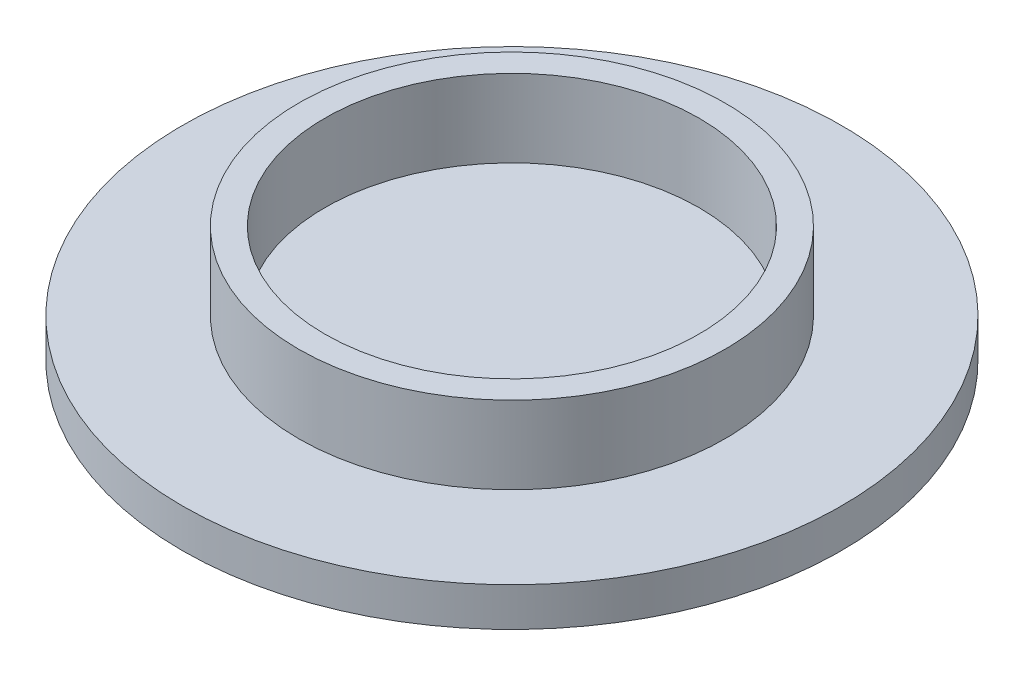
ISO-10303-21;
HEADER;
FILE_DESCRIPTION(('STEP AP214'),'2;1');
FILE_NAME('part.step','',(''),(''),'','','');
FILE_SCHEMA(('AUTOMOTIVE_DESIGN { 1 0 10303 214 1 1 1 1 }'));
ENDSEC;
DATA;
#1=APPLICATION_CONTEXT('core data for automotive mechanical design processes');
#2=APPLICATION_PROTOCOL_DEFINITION('international standard','automotive_design',2000,#1);
#3=PRODUCT_CONTEXT('',#1,'mechanical');
#4=PRODUCT('Part','Part','',(#3));
#5=PRODUCT_RELATED_PRODUCT_CATEGORY('part','',(#4));
#6=PRODUCT_DEFINITION_FORMATION('','',#4);
#7=PRODUCT_DEFINITION_CONTEXT('part definition',#1,'design');
#8=PRODUCT_DEFINITION('design','',#6,#7);
#9=PRODUCT_DEFINITION_SHAPE('','',#8);
#10=(LENGTH_UNIT() NAMED_UNIT(*) SI_UNIT(.MILLI.,.METRE.));
#11=(NAMED_UNIT(*) PLANE_ANGLE_UNIT() SI_UNIT($,.RADIAN.));
#12=(NAMED_UNIT(*) SI_UNIT($,.STERADIAN.) SOLID_ANGLE_UNIT());
#13=UNCERTAINTY_MEASURE_WITH_UNIT(LENGTH_MEASURE(1.E-05),#10,'distance_accuracy_value','');
#14=(GEOMETRIC_REPRESENTATION_CONTEXT(3) GLOBAL_UNCERTAINTY_ASSIGNED_CONTEXT((#13)) GLOBAL_UNIT_ASSIGNED_CONTEXT((#10,
#11,#12)) REPRESENTATION_CONTEXT('',''));
#15=CARTESIAN_POINT('',(0.,0.,0.));
#16=DIRECTION('',(0.,0.,1.));
#17=DIRECTION('',(1.,0.,0.));
#18=AXIS2_PLACEMENT_3D('',#15,#16,#17);
#19=CARTESIAN_POINT('',(0.,-1.,0.));
#20=DIRECTION('',(0.,1.,0.));
#21=DIRECTION('',(0.,0.,1.));
#22=AXIS2_PLACEMENT_3D('',#19,#20,#21);
#23=CYLINDRICAL_SURFACE('',#22,17.);
#24=CARTESIAN_POINT('',(0.,0.,0.));
#25=DIRECTION('',(0.,1.,0.));
#26=DIRECTION('',(0.,0.,1.));
#27=AXIS2_PLACEMENT_3D('',#24,#25,#26);
#28=CIRCLE('',#27,17.);
#29=CARTESIAN_POINT('',(0.,0.,17.));
#30=VERTEX_POINT('',#29);
#31=EDGE_CURVE('E42',#30,#30,#28,.T.);
#32=ORIENTED_EDGE('',*,*,#31,.F.);
#33=EDGE_LOOP('',(#32));
#34=FACE_BOUND('',#33,.T.);
#35=CARTESIAN_POINT('',(0.,-2.,0.));
#36=DIRECTION('',(0.,1.,0.));
#37=DIRECTION('',(0.,0.,1.));
#38=AXIS2_PLACEMENT_3D('',#35,#36,#37);
#39=CIRCLE('',#38,17.);
#40=CARTESIAN_POINT('',(0.,-2.,17.));
#41=VERTEX_POINT('',#40);
#42=EDGE_CURVE('E57',#41,#41,#39,.T.);
#43=ORIENTED_EDGE('',*,*,#42,.T.);
#44=EDGE_LOOP('',(#43));
#45=FACE_BOUND('',#44,.T.);
#46=ADVANCED_FACE('F32',(#34,#45),#23,.T.);
#47=CARTESIAN_POINT('',(0.,0.,0.));
#48=DIRECTION('',(0.,1.,0.));
#49=DIRECTION('',(0.,0.,1.));
#50=AXIS2_PLACEMENT_3D('',#47,#48,#49);
#51=PLANE('',#50);
#52=CARTESIAN_POINT('',(0.,0.,0.));
#53=DIRECTION('',(0.,1.,0.));
#54=DIRECTION('',(0.,0.,1.));
#55=AXIS2_PLACEMENT_3D('',#52,#53,#54);
#56=CIRCLE('',#55,11.);
#57=CARTESIAN_POINT('',(0.,0.,11.));
#58=VERTEX_POINT('',#57);
#59=EDGE_CURVE('E49',#58,#58,#56,.T.);
#60=ORIENTED_EDGE('',*,*,#59,.F.);
#61=EDGE_LOOP('',(#60));
#62=FACE_BOUND('',#61,.T.);
#63=ORIENTED_EDGE('',*,*,#31,.T.);
#64=EDGE_LOOP('',(#63));
#65=FACE_BOUND('',#64,.T.);
#66=ADVANCED_FACE('F92',(#62,#65),#51,.T.);
#67=CARTESIAN_POINT('',(0.,4.,0.));
#68=DIRECTION('',(0.,1.,0.));
#69=DIRECTION('',(0.,0.,1.));
#70=AXIS2_PLACEMENT_3D('',#67,#68,#69);
#71=PLANE('',#70);
#72=CARTESIAN_POINT('',(0.,4.,0.));
#73=DIRECTION('',(0.,1.,0.));
#74=DIRECTION('',(0.,0.,1.));
#75=AXIS2_PLACEMENT_3D('',#72,#73,#74);
#76=CIRCLE('',#75,11.);
#77=CARTESIAN_POINT('',(0.,4.,11.));
#78=VERTEX_POINT('',#77);
#79=EDGE_CURVE('E46',#78,#78,#76,.T.);
#80=ORIENTED_EDGE('',*,*,#79,.T.);
#81=EDGE_LOOP('',(#80));
#82=FACE_BOUND('',#81,.T.);
#83=CARTESIAN_POINT('',(0.,4.,0.));
#84=DIRECTION('',(0.,1.,0.));
#85=DIRECTION('',(0.,0.,1.));
#86=AXIS2_PLACEMENT_3D('',#83,#84,#85);
#87=CIRCLE('',#86,9.652);
#88=CARTESIAN_POINT('',(0.,4.,9.652));
#89=VERTEX_POINT('',#88);
#90=EDGE_CURVE('E52',#89,#89,#87,.T.);
#91=ORIENTED_EDGE('',*,*,#90,.F.);
#92=EDGE_LOOP('',(#91));
#93=FACE_BOUND('',#92,.T.);
#94=ADVANCED_FACE('F97',(#82,#93),#71,.T.);
#95=CARTESIAN_POINT('',(0.,4.,0.));
#96=DIRECTION('',(0.,-1.,0.));
#97=DIRECTION('',(0.,0.,-1.));
#98=AXIS2_PLACEMENT_3D('',#95,#96,#97);
#99=CYLINDRICAL_SURFACE('',#98,11.);
#100=ORIENTED_EDGE('',*,*,#79,.F.);
#101=EDGE_LOOP('',(#100));
#102=FACE_BOUND('',#101,.T.);
#103=ORIENTED_EDGE('',*,*,#59,.T.);
#104=EDGE_LOOP('',(#103));
#105=FACE_BOUND('',#104,.T.);
#106=ADVANCED_FACE('F107',(#102,#105),#99,.T.);
#107=CARTESIAN_POINT('',(0.,4.,0.));
#108=DIRECTION('',(0.,-1.,0.));
#109=DIRECTION('',(0.,0.,-1.));
#110=AXIS2_PLACEMENT_3D('',#107,#108,#109);
#111=CYLINDRICAL_SURFACE('',#110,9.652);
#112=ORIENTED_EDGE('',*,*,#90,.T.);
#113=EDGE_LOOP('',(#112));
#114=FACE_BOUND('',#113,.T.);
#115=CARTESIAN_POINT('',(0.,0.,0.));
#116=DIRECTION('',(0.,1.,0.));
#117=DIRECTION('',(0.,0.,1.));
#118=AXIS2_PLACEMENT_3D('',#115,#116,#117);
#119=CIRCLE('',#118,9.652);
#120=CARTESIAN_POINT('',(0.,0.,9.652));
#121=VERTEX_POINT('',#120);
#122=EDGE_CURVE('E38',#121,#121,#119,.F.);
#123=ORIENTED_EDGE('',*,*,#122,.T.);
#124=EDGE_LOOP('',(#123));
#125=FACE_BOUND('',#124,.T.);
#126=ADVANCED_FACE('F113',(#114,#125),#111,.F.);
#127=ORIENTED_EDGE('',*,*,#122,.F.);
#128=EDGE_LOOP('',(#127));
#129=FACE_BOUND('',#128,.T.);
#130=ADVANCED_FACE('F89',(#129),#51,.T.);
#131=CARTESIAN_POINT('',(0.,-2.,0.));
#132=DIRECTION('',(0.,-1.,0.));
#133=DIRECTION('',(0.,0.,1.));
#134=AXIS2_PLACEMENT_3D('',#131,#132,#133);
#135=PLANE('',#134);
#136=CARTESIAN_POINT('',(0.,-2.,0.));
#137=DIRECTION('',(0.,-1.,0.));
#138=DIRECTION('',(0.,0.,-1.));
#139=AXIS2_PLACEMENT_3D('',#136,#137,#138);
#140=CIRCLE('',#139,11.);
#141=CARTESIAN_POINT('',(0.,-2.,-11.));
#142=VERTEX_POINT('',#141);
#143=EDGE_CURVE('E10',#142,#142,#140,.T.);
#144=ORIENTED_EDGE('',*,*,#143,.F.);
#145=EDGE_LOOP('',(#144));
#146=FACE_BOUND('',#145,.T.);
#147=ORIENTED_EDGE('',*,*,#42,.F.);
#148=EDGE_LOOP('',(#147));
#149=FACE_BOUND('',#148,.T.);
#150=ADVANCED_FACE('F82',(#146,#149),#135,.T.);
#151=CARTESIAN_POINT('',(0.,-6.,0.));
#152=DIRECTION('',(0.,1.,0.));
#153=DIRECTION('',(0.,0.,1.));
#154=AXIS2_PLACEMENT_3D('',#151,#152,#153);
#155=CYLINDRICAL_SURFACE('',#154,11.);
#156=CARTESIAN_POINT('',(0.,-6.,0.));
#157=DIRECTION('',(0.,1.,0.));
#158=DIRECTION('',(0.,0.,1.));
#159=AXIS2_PLACEMENT_3D('',#156,#157,#158);
#160=CIRCLE('',#159,11.);
#161=CARTESIAN_POINT('',(0.,-6.,11.));
#162=VERTEX_POINT('',#161);
#163=EDGE_CURVE('E60',#162,#162,#160,.T.);
#164=ORIENTED_EDGE('',*,*,#163,.T.);
#165=EDGE_LOOP('',(#164));
#166=FACE_BOUND('',#165,.T.);
#167=ORIENTED_EDGE('',*,*,#143,.T.);
#168=EDGE_LOOP('',(#167));
#169=FACE_BOUND('',#168,.T.);
#170=ADVANCED_FACE('F88',(#166,#169),#155,.T.);
#171=CARTESIAN_POINT('',(0.,-6.,0.));
#172=DIRECTION('',(0.,-1.,0.));
#173=DIRECTION('',(0.,0.,1.));
#174=AXIS2_PLACEMENT_3D('',#171,#172,#173);
#175=PLANE('',#174);
#176=CARTESIAN_POINT('',(0.,-6.,0.));
#177=DIRECTION('',(0.,1.,0.));
#178=DIRECTION('',(0.,0.,1.));
#179=AXIS2_PLACEMENT_3D('',#176,#177,#178);
#180=CIRCLE('',#179,9.652);
#181=CARTESIAN_POINT('',(0.,-6.,9.652));
#182=VERTEX_POINT('',#181);
#183=EDGE_CURVE('E63',#182,#182,#180,.T.);
#184=ORIENTED_EDGE('',*,*,#183,.T.);
#185=EDGE_LOOP('',(#184));
#186=FACE_BOUND('',#185,.T.);
#187=ORIENTED_EDGE('',*,*,#163,.F.);
#188=EDGE_LOOP('',(#187));
#189=FACE_BOUND('',#188,.T.);
#190=ADVANCED_FACE('F70',(#186,#189),#175,.T.);
#191=CARTESIAN_POINT('',(0.,-6.,0.));
#192=DIRECTION('',(0.,1.,0.));
#193=DIRECTION('',(0.,0.,1.));
#194=AXIS2_PLACEMENT_3D('',#191,#192,#193);
#195=CYLINDRICAL_SURFACE('',#194,9.652);
#196=ORIENTED_EDGE('',*,*,#183,.F.);
#197=EDGE_LOOP('',(#196));
#198=FACE_BOUND('',#197,.T.);
#199=CARTESIAN_POINT('',(0.,-2.,0.));
#200=DIRECTION('',(0.,1.,0.));
#201=DIRECTION('',(0.,0.,1.));
#202=AXIS2_PLACEMENT_3D('',#199,#200,#201);
#203=CIRCLE('',#202,9.652);
#204=CARTESIAN_POINT('',(0.,-2.,9.652));
#205=VERTEX_POINT('',#204);
#206=EDGE_CURVE('E64',#205,#205,#203,.T.);
#207=ORIENTED_EDGE('',*,*,#206,.T.);
#208=EDGE_LOOP('',(#207));
#209=FACE_BOUND('',#208,.T.);
#210=ADVANCED_FACE('F73',(#198,#209),#195,.F.);
#211=ORIENTED_EDGE('',*,*,#206,.F.);
#212=EDGE_LOOP('',(#211));
#213=FACE_BOUND('',#212,.T.);
#214=ADVANCED_FACE('F76',(#213),#135,.T.);
#215=CLOSED_SHELL('',(#46,#66,#94,#106,#126,#130,#150,#170,#190,#210,#214));
#216=MANIFOLD_SOLID_BREP('B2',#215);
#217=ADVANCED_BREP_SHAPE_REPRESENTATION('',(#18,#216),#14);
#218=SHAPE_DEFINITION_REPRESENTATION(#9,#217);
ENDSEC;
END-ISO-10303-21;
